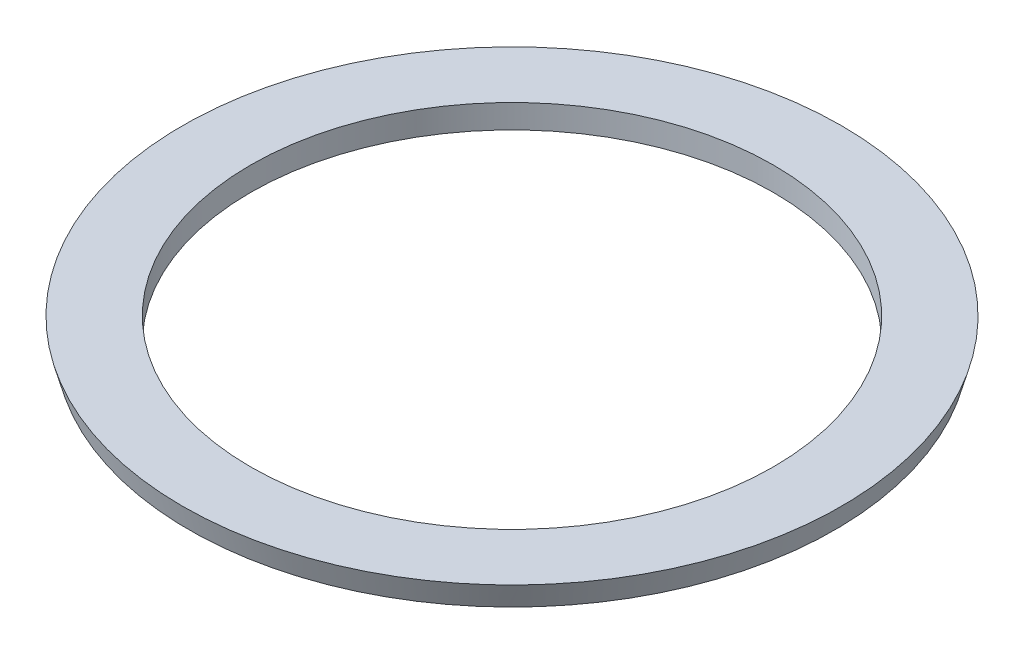
ISO-10303-21;
HEADER;
FILE_DESCRIPTION(('STEP AP214'),'2;1');
FILE_NAME('part.step','',(''),(''),'','','');
FILE_SCHEMA(('AUTOMOTIVE_DESIGN { 1 0 10303 214 1 1 1 1 }'));
ENDSEC;
DATA;
#1=APPLICATION_CONTEXT('core data for automotive mechanical design processes');
#2=APPLICATION_PROTOCOL_DEFINITION('international standard','automotive_design',2000,#1);
#3=PRODUCT_CONTEXT('',#1,'mechanical');
#4=PRODUCT('Part','Part','',(#3));
#5=PRODUCT_RELATED_PRODUCT_CATEGORY('part','',(#4));
#6=PRODUCT_DEFINITION_FORMATION('','',#4);
#7=PRODUCT_DEFINITION_CONTEXT('part definition',#1,'design');
#8=PRODUCT_DEFINITION('design','',#6,#7);
#9=PRODUCT_DEFINITION_SHAPE('','',#8);
#10=(LENGTH_UNIT() NAMED_UNIT(*) SI_UNIT(.MILLI.,.METRE.));
#11=(NAMED_UNIT(*) PLANE_ANGLE_UNIT() SI_UNIT($,.RADIAN.));
#12=(NAMED_UNIT(*) SI_UNIT($,.STERADIAN.) SOLID_ANGLE_UNIT());
#13=UNCERTAINTY_MEASURE_WITH_UNIT(LENGTH_MEASURE(1.E-05),#10,'distance_accuracy_value','');
#14=(GEOMETRIC_REPRESENTATION_CONTEXT(3) GLOBAL_UNCERTAINTY_ASSIGNED_CONTEXT((#13)) GLOBAL_UNIT_ASSIGNED_CONTEXT((#10,
#11,#12)) REPRESENTATION_CONTEXT('',''));
#15=CARTESIAN_POINT('',(0.,0.,0.));
#16=DIRECTION('',(0.,0.,1.));
#17=DIRECTION('',(1.,0.,0.));
#18=AXIS2_PLACEMENT_3D('',#15,#16,#17);
#19=CARTESIAN_POINT('',(0.,0.,0.));
#20=DIRECTION('',(0.,-1.,0.));
#21=DIRECTION('',(0.,0.,-1.));
#22=AXIS2_PLACEMENT_3D('',#19,#20,#21);
#23=CYLINDRICAL_SURFACE('',#22,22.);
#24=CARTESIAN_POINT('',(0.,33.8,0.));
#25=DIRECTION('',(0.,-1.,0.));
#26=DIRECTION('',(0.,0.,-1.));
#27=AXIS2_PLACEMENT_3D('',#24,#25,#26);
#28=CIRCLE('',#27,22.);
#29=CARTESIAN_POINT('',(0.,33.8,-22.));
#30=VERTEX_POINT('',#29);
#31=EDGE_CURVE('E10',#30,#30,#28,.T.);
#32=ORIENTED_EDGE('',*,*,#31,.T.);
#33=EDGE_LOOP('',(#32));
#34=FACE_BOUND('',#33,.T.);
#35=CARTESIAN_POINT('',(0.,35.8,0.));
#36=DIRECTION('',(0.,-1.,0.));
#37=DIRECTION('',(0.,0.,-1.));
#38=AXIS2_PLACEMENT_3D('',#35,#36,#37);
#39=CIRCLE('',#38,22.);
#40=CARTESIAN_POINT('',(0.,35.8,-22.));
#41=VERTEX_POINT('',#40);
#42=EDGE_CURVE('E51',#41,#41,#39,.T.);
#43=ORIENTED_EDGE('',*,*,#42,.F.);
#44=EDGE_LOOP('',(#43));
#45=FACE_BOUND('',#44,.T.);
#46=ADVANCED_FACE('F40',(#34,#45),#23,.F.);
#47=CARTESIAN_POINT('',(22.,33.8,0.));
#48=DIRECTION('',(0.,-1.,0.));
#49=DIRECTION('',(0.,0.,-1.));
#50=AXIS2_PLACEMENT_3D('',#47,#48,#49);
#51=PLANE('',#50);
#52=CARTESIAN_POINT('',(0.,33.8,0.));
#53=DIRECTION('',(0.,-1.,0.));
#54=DIRECTION('',(0.,0.,-1.));
#55=AXIS2_PLACEMENT_3D('',#52,#53,#54);
#56=CIRCLE('',#55,27.1810416467804);
#57=CARTESIAN_POINT('',(0.,33.8,-27.1810416467804));
#58=VERTEX_POINT('',#57);
#59=EDGE_CURVE('E43',#58,#58,#56,.T.);
#60=ORIENTED_EDGE('',*,*,#59,.T.);
#61=EDGE_LOOP('',(#60));
#62=FACE_BOUND('',#61,.T.);
#63=ORIENTED_EDGE('',*,*,#31,.F.);
#64=EDGE_LOOP('',(#63));
#65=FACE_BOUND('',#64,.T.);
#66=ADVANCED_FACE('F61',(#62,#65),#51,.T.);
#67=CARTESIAN_POINT('',(0.,33.8,0.));
#68=DIRECTION('',(0.,1.,0.));
#69=DIRECTION('',(0.,0.,1.));
#70=AXIS2_PLACEMENT_3D('',#67,#68,#69);
#71=CONICAL_SURFACE('',#70,27.1810416467804,0.2691674927857);
#72=CARTESIAN_POINT('',(0.,35.8,0.));
#73=DIRECTION('',(0.,-1.,0.));
#74=DIRECTION('',(0.,0.,-1.));
#75=AXIS2_PLACEMENT_3D('',#72,#73,#74);
#76=CIRCLE('',#75,27.7327657847114);
#77=CARTESIAN_POINT('',(0.,35.8,-27.7327657847114));
#78=VERTEX_POINT('',#77);
#79=EDGE_CURVE('E50',#78,#78,#76,.T.);
#80=ORIENTED_EDGE('',*,*,#79,.T.);
#81=EDGE_LOOP('',(#80));
#82=FACE_BOUND('',#81,.T.);
#83=ORIENTED_EDGE('',*,*,#59,.F.);
#84=EDGE_LOOP('',(#83));
#85=FACE_BOUND('',#84,.T.);
#86=ADVANCED_FACE('F65',(#82,#85),#71,.T.);
#87=CARTESIAN_POINT('',(27.7327657847114,35.8,0.));
#88=DIRECTION('',(0.,1.,0.));
#89=DIRECTION('',(0.,0.,1.));
#90=AXIS2_PLACEMENT_3D('',#87,#88,#89);
#91=PLANE('',#90);
#92=ORIENTED_EDGE('',*,*,#42,.T.);
#93=EDGE_LOOP('',(#92));
#94=FACE_BOUND('',#93,.T.);
#95=ORIENTED_EDGE('',*,*,#79,.F.);
#96=EDGE_LOOP('',(#95));
#97=FACE_BOUND('',#96,.T.);
#98=ADVANCED_FACE('F60',(#94,#97),#91,.T.);
#99=CLOSED_SHELL('',(#46,#66,#86,#98));
#100=MANIFOLD_SOLID_BREP('B2',#99);
#101=ADVANCED_BREP_SHAPE_REPRESENTATION('',(#18,#100),#14);
#102=SHAPE_DEFINITION_REPRESENTATION(#9,#101);
ENDSEC;
END-ISO-10303-21;
